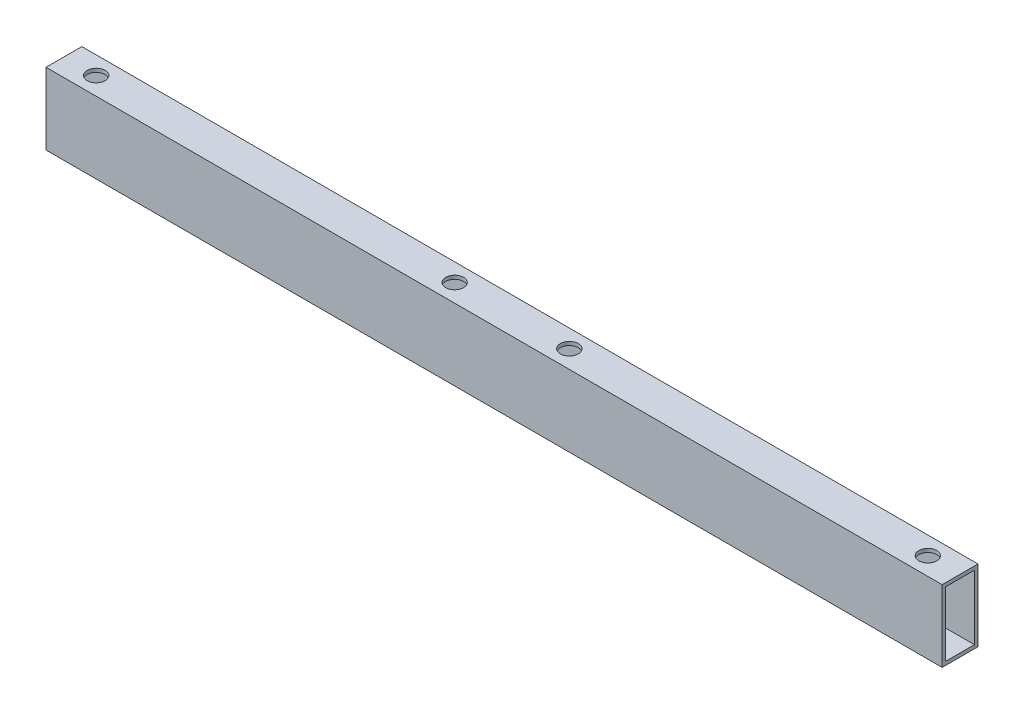
ISO-10303-21;
HEADER;
FILE_DESCRIPTION(('STEP AP214'),'2;1');
FILE_NAME('part.step','',(''),(''),'','','');
FILE_SCHEMA(('AUTOMOTIVE_DESIGN { 1 0 10303 214 1 1 1 1 }'));
ENDSEC;
DATA;
#1=APPLICATION_CONTEXT('core data for automotive mechanical design processes');
#2=APPLICATION_PROTOCOL_DEFINITION('international standard','automotive_design',2000,#1);
#3=PRODUCT_CONTEXT('',#1,'mechanical');
#4=PRODUCT('Part','Part','',(#3));
#5=PRODUCT_RELATED_PRODUCT_CATEGORY('part','',(#4));
#6=PRODUCT_DEFINITION_FORMATION('','',#4);
#7=PRODUCT_DEFINITION_CONTEXT('part definition',#1,'design');
#8=PRODUCT_DEFINITION('design','',#6,#7);
#9=PRODUCT_DEFINITION_SHAPE('','',#8);
#10=(LENGTH_UNIT() NAMED_UNIT(*) SI_UNIT(.MILLI.,.METRE.));
#11=(NAMED_UNIT(*) PLANE_ANGLE_UNIT() SI_UNIT($,.RADIAN.));
#12=(NAMED_UNIT(*) SI_UNIT($,.STERADIAN.) SOLID_ANGLE_UNIT());
#13=UNCERTAINTY_MEASURE_WITH_UNIT(LENGTH_MEASURE(1.E-05),#10,'distance_accuracy_value','');
#14=(GEOMETRIC_REPRESENTATION_CONTEXT(3) GLOBAL_UNCERTAINTY_ASSIGNED_CONTEXT((#13)) GLOBAL_UNIT_ASSIGNED_CONTEXT((#10,
#11,#12)) REPRESENTATION_CONTEXT('',''));
#15=CARTESIAN_POINT('',(0.,0.,0.));
#16=DIRECTION('',(0.,0.,1.));
#17=DIRECTION('',(1.,0.,0.));
#18=AXIS2_PLACEMENT_3D('',#15,#16,#17);
#19=CARTESIAN_POINT('',(250.,0.,0.));
#20=DIRECTION('',(-1.,0.,0.));
#21=DIRECTION('',(0.,0.,1.));
#22=AXIS2_PLACEMENT_3D('',#19,#20,#21);
#23=PLANE('',#22);
#24=DIRECTION('',(0.,1.,0.));
#25=VECTOR('',#24,1.);
#26=CARTESIAN_POINT('',(250.,-10.,-5.));
#27=LINE('',#26,#25);
#28=CARTESIAN_POINT('',(250.,-10.,-5.));
#29=VERTEX_POINT('',#28);
#30=CARTESIAN_POINT('',(250.,10.,-5.));
#31=VERTEX_POINT('',#30);
#32=EDGE_CURVE('E148',#29,#31,#27,.T.);
#33=ORIENTED_EDGE('',*,*,#32,.T.);
#34=DIRECTION('',(0.,0.,1.));
#35=VECTOR('',#34,1.);
#36=CARTESIAN_POINT('',(250.,10.,5.));
#37=LINE('',#36,#35);
#38=CARTESIAN_POINT('',(250.,10.,5.));
#39=VERTEX_POINT('',#38);
#40=EDGE_CURVE('E151',#31,#39,#37,.T.);
#41=ORIENTED_EDGE('',*,*,#40,.T.);
#42=DIRECTION('',(0.,-1.,0.));
#43=VECTOR('',#42,1.);
#44=CARTESIAN_POINT('',(250.,-10.,5.));
#45=LINE('',#44,#43);
#46=CARTESIAN_POINT('',(250.,-10.,5.));
#47=VERTEX_POINT('',#46);
#48=EDGE_CURVE('E154',#39,#47,#45,.T.);
#49=ORIENTED_EDGE('',*,*,#48,.T.);
#50=DIRECTION('',(0.,0.,-1.));
#51=VECTOR('',#50,1.);
#52=CARTESIAN_POINT('',(250.,-10.,5.));
#53=LINE('',#52,#51);
#54=EDGE_CURVE('E156',#47,#29,#53,.T.);
#55=ORIENTED_EDGE('',*,*,#54,.T.);
#56=EDGE_LOOP('',(#33,#41,#49,#55));
#57=FACE_BOUND('',#56,.T.);
#58=DIRECTION('',(0.,0.,-1.));
#59=VECTOR('',#58,1.);
#60=CARTESIAN_POINT('',(250.,-9.,4.));
#61=LINE('',#60,#59);
#62=CARTESIAN_POINT('',(250.,-9.,4.));
#63=VERTEX_POINT('',#62);
#64=CARTESIAN_POINT('',(250.,-9.,-4.));
#65=VERTEX_POINT('',#64);
#66=EDGE_CURVE('E110',#63,#65,#61,.T.);
#67=ORIENTED_EDGE('',*,*,#66,.F.);
#68=DIRECTION('',(0.,-1.,0.));
#69=VECTOR('',#68,1.);
#70=CARTESIAN_POINT('',(250.,-9.,4.));
#71=LINE('',#70,#69);
#72=CARTESIAN_POINT('',(250.,9.,4.));
#73=VERTEX_POINT('',#72);
#74=EDGE_CURVE('E132',#73,#63,#71,.T.);
#75=ORIENTED_EDGE('',*,*,#74,.F.);
#76=DIRECTION('',(0.,0.,1.));
#77=VECTOR('',#76,1.);
#78=CARTESIAN_POINT('',(250.,9.,4.));
#79=LINE('',#78,#77);
#80=CARTESIAN_POINT('',(250.,9.,-4.));
#81=VERTEX_POINT('',#80);
#82=EDGE_CURVE('E130',#81,#73,#79,.T.);
#83=ORIENTED_EDGE('',*,*,#82,.F.);
#84=DIRECTION('',(0.,1.,0.));
#85=VECTOR('',#84,1.);
#86=CARTESIAN_POINT('',(250.,-9.,-4.));
#87=LINE('',#86,#85);
#88=EDGE_CURVE('E118',#65,#81,#87,.T.);
#89=ORIENTED_EDGE('',*,*,#88,.F.);
#90=EDGE_LOOP('',(#67,#75,#83,#89));
#91=FACE_BOUND('',#90,.T.);
#92=ADVANCED_FACE('F43',(#57,#91),#23,.F.);
#93=CARTESIAN_POINT('',(0.,0.,0.));
#94=DIRECTION('',(-1.,0.,0.));
#95=DIRECTION('',(0.,0.,1.));
#96=AXIS2_PLACEMENT_3D('',#93,#94,#95);
#97=PLANE('',#96);
#98=DIRECTION('',(0.,1.,0.));
#99=VECTOR('',#98,1.);
#100=CARTESIAN_POINT('',(0.,-10.,-5.));
#101=LINE('',#100,#99);
#102=CARTESIAN_POINT('',(0.,-10.,-5.));
#103=VERTEX_POINT('',#102);
#104=CARTESIAN_POINT('',(0.,10.,-5.));
#105=VERTEX_POINT('',#104);
#106=EDGE_CURVE('E126',#103,#105,#101,.T.);
#107=ORIENTED_EDGE('',*,*,#106,.F.);
#108=DIRECTION('',(0.,0.,-1.));
#109=VECTOR('',#108,1.);
#110=CARTESIAN_POINT('',(0.,-10.,5.));
#111=LINE('',#110,#109);
#112=CARTESIAN_POINT('',(0.,-10.,5.));
#113=VERTEX_POINT('',#112);
#114=EDGE_CURVE('E152',#113,#103,#111,.T.);
#115=ORIENTED_EDGE('',*,*,#114,.F.);
#116=DIRECTION('',(0.,-1.,0.));
#117=VECTOR('',#116,1.);
#118=CARTESIAN_POINT('',(0.,-10.,5.));
#119=LINE('',#118,#117);
#120=CARTESIAN_POINT('',(0.,10.,5.));
#121=VERTEX_POINT('',#120);
#122=EDGE_CURVE('E163',#121,#113,#119,.T.);
#123=ORIENTED_EDGE('',*,*,#122,.F.);
#124=DIRECTION('',(0.,0.,1.));
#125=VECTOR('',#124,1.);
#126=CARTESIAN_POINT('',(0.,10.,5.));
#127=LINE('',#126,#125);
#128=EDGE_CURVE('E161',#105,#121,#127,.T.);
#129=ORIENTED_EDGE('',*,*,#128,.F.);
#130=EDGE_LOOP('',(#107,#115,#123,#129));
#131=FACE_BOUND('',#130,.T.);
#132=DIRECTION('',(0.,-1.,0.));
#133=VECTOR('',#132,1.);
#134=CARTESIAN_POINT('',(0.,-9.,4.));
#135=LINE('',#134,#133);
#136=CARTESIAN_POINT('',(0.,9.,4.));
#137=VERTEX_POINT('',#136);
#138=CARTESIAN_POINT('',(0.,-9.,4.));
#139=VERTEX_POINT('',#138);
#140=EDGE_CURVE('E119',#137,#139,#135,.T.);
#141=ORIENTED_EDGE('',*,*,#140,.T.);
#142=DIRECTION('',(0.,0.,-1.));
#143=VECTOR('',#142,1.);
#144=CARTESIAN_POINT('',(0.,-9.,4.));
#145=LINE('',#144,#143);
#146=CARTESIAN_POINT('',(0.,-9.,-4.));
#147=VERTEX_POINT('',#146);
#148=EDGE_CURVE('E68',#139,#147,#145,.T.);
#149=ORIENTED_EDGE('',*,*,#148,.T.);
#150=DIRECTION('',(0.,1.,0.));
#151=VECTOR('',#150,1.);
#152=CARTESIAN_POINT('',(0.,-9.,-4.));
#153=LINE('',#152,#151);
#154=CARTESIAN_POINT('',(0.,9.,-4.));
#155=VERTEX_POINT('',#154);
#156=EDGE_CURVE('E125',#147,#155,#153,.T.);
#157=ORIENTED_EDGE('',*,*,#156,.T.);
#158=DIRECTION('',(0.,0.,1.));
#159=VECTOR('',#158,1.);
#160=CARTESIAN_POINT('',(0.,9.,4.));
#161=LINE('',#160,#159);
#162=EDGE_CURVE('E140',#155,#137,#161,.T.);
#163=ORIENTED_EDGE('',*,*,#162,.T.);
#164=EDGE_LOOP('',(#141,#149,#157,#163));
#165=FACE_BOUND('',#164,.T.);
#166=ADVANCED_FACE('F252',(#131,#165),#97,.T.);
#167=CARTESIAN_POINT('',(250.,-10.,-5.));
#168=DIRECTION('',(0.,0.,1.));
#169=DIRECTION('',(1.,0.,0.));
#170=AXIS2_PLACEMENT_3D('',#167,#168,#169);
#171=PLANE('',#170);
#172=ORIENTED_EDGE('',*,*,#106,.T.);
#173=DIRECTION('',(-1.,0.,0.));
#174=VECTOR('',#173,1.);
#175=CARTESIAN_POINT('',(250.,10.,-5.));
#176=LINE('',#175,#174);
#177=EDGE_CURVE('E11',#31,#105,#176,.T.);
#178=ORIENTED_EDGE('',*,*,#177,.F.);
#179=ORIENTED_EDGE('',*,*,#32,.F.);
#180=DIRECTION('',(-1.,0.,0.));
#181=VECTOR('',#180,1.);
#182=CARTESIAN_POINT('',(250.,-10.,-5.));
#183=LINE('',#182,#181);
#184=EDGE_CURVE('E158',#29,#103,#183,.T.);
#185=ORIENTED_EDGE('',*,*,#184,.T.);
#186=EDGE_LOOP('',(#172,#178,#179,#185));
#187=FACE_BOUND('',#186,.T.);
#188=ADVANCED_FACE('F45',(#187),#171,.F.);
#189=CARTESIAN_POINT('',(250.,10.,5.));
#190=DIRECTION('',(0.,-1.,0.));
#191=DIRECTION('',(0.,0.,-1.));
#192=AXIS2_PLACEMENT_3D('',#189,#190,#191);
#193=PLANE('',#192);
#194=CARTESIAN_POINT('',(109.,10.,0.));
#195=DIRECTION('',(0.,1.,0.));
#196=DIRECTION('',(0.,0.,1.));
#197=AXIS2_PLACEMENT_3D('',#194,#195,#196);
#198=CIRCLE('',#197,2.5);
#199=CARTESIAN_POINT('',(109.,10.,2.49999999999998));
#200=VERTEX_POINT('',#199);
#201=EDGE_CURVE('E189',#200,#200,#198,.T.);
#202=ORIENTED_EDGE('',*,*,#201,.F.);
#203=EDGE_LOOP('',(#202));
#204=FACE_BOUND('',#203,.T.);
#205=CARTESIAN_POINT('',(141.,10.,0.));
#206=DIRECTION('',(0.,1.,0.));
#207=DIRECTION('',(0.,0.,1.));
#208=AXIS2_PLACEMENT_3D('',#205,#206,#207);
#209=CIRCLE('',#208,2.5);
#210=CARTESIAN_POINT('',(141.,10.,2.49999999999997));
#211=VERTEX_POINT('',#210);
#212=EDGE_CURVE('E194',#211,#211,#209,.T.);
#213=ORIENTED_EDGE('',*,*,#212,.F.);
#214=EDGE_LOOP('',(#213));
#215=FACE_BOUND('',#214,.T.);
#216=CARTESIAN_POINT('',(241.,10.,0.));
#217=DIRECTION('',(0.,1.,0.));
#218=DIRECTION('',(0.,0.,1.));
#219=AXIS2_PLACEMENT_3D('',#216,#217,#218);
#220=CIRCLE('',#219,2.5);
#221=CARTESIAN_POINT('',(241.,10.,2.5));
#222=VERTEX_POINT('',#221);
#223=EDGE_CURVE('E208',#222,#222,#220,.T.);
#224=ORIENTED_EDGE('',*,*,#223,.F.);
#225=EDGE_LOOP('',(#224));
#226=FACE_BOUND('',#225,.T.);
#227=CARTESIAN_POINT('',(9.,10.,0.));
#228=DIRECTION('',(0.,1.,0.));
#229=DIRECTION('',(0.,0.,1.));
#230=AXIS2_PLACEMENT_3D('',#227,#228,#229);
#231=CIRCLE('',#230,2.5);
#232=CARTESIAN_POINT('',(9.,10.,2.5));
#233=VERTEX_POINT('',#232);
#234=EDGE_CURVE('E211',#233,#233,#231,.T.);
#235=ORIENTED_EDGE('',*,*,#234,.F.);
#236=EDGE_LOOP('',(#235));
#237=FACE_BOUND('',#236,.T.);
#238=ORIENTED_EDGE('',*,*,#128,.T.);
#239=DIRECTION('',(-1.,0.,0.));
#240=VECTOR('',#239,1.);
#241=CARTESIAN_POINT('',(250.,10.,5.));
#242=LINE('',#241,#240);
#243=EDGE_CURVE('E52',#39,#121,#242,.T.);
#244=ORIENTED_EDGE('',*,*,#243,.F.);
#245=ORIENTED_EDGE('',*,*,#40,.F.);
#246=ORIENTED_EDGE('',*,*,#177,.T.);
#247=EDGE_LOOP('',(#238,#244,#245,#246));
#248=FACE_BOUND('',#247,.T.);
#249=ADVANCED_FACE('F256',(#204,#215,#226,#237,#248),#193,.F.);
#250=CARTESIAN_POINT('',(250.,-10.,5.));
#251=DIRECTION('',(0.,0.,-1.));
#252=DIRECTION('',(-1.,0.,0.));
#253=AXIS2_PLACEMENT_3D('',#250,#251,#252);
#254=PLANE('',#253);
#255=ORIENTED_EDGE('',*,*,#122,.T.);
#256=DIRECTION('',(-1.,0.,0.));
#257=VECTOR('',#256,1.);
#258=CARTESIAN_POINT('',(250.,-10.,5.));
#259=LINE('',#258,#257);
#260=EDGE_CURVE('E168',#47,#113,#259,.T.);
#261=ORIENTED_EDGE('',*,*,#260,.F.);
#262=ORIENTED_EDGE('',*,*,#48,.F.);
#263=ORIENTED_EDGE('',*,*,#243,.T.);
#264=EDGE_LOOP('',(#255,#261,#262,#263));
#265=FACE_BOUND('',#264,.T.);
#266=ADVANCED_FACE('F240',(#265),#254,.F.);
#267=CARTESIAN_POINT('',(250.,-10.,5.));
#268=DIRECTION('',(0.,1.,0.));
#269=DIRECTION('',(0.,0.,1.));
#270=AXIS2_PLACEMENT_3D('',#267,#268,#269);
#271=PLANE('',#270);
#272=CARTESIAN_POINT('',(109.,-10.,0.));
#273=DIRECTION('',(0.,1.,0.));
#274=DIRECTION('',(0.,0.,1.));
#275=AXIS2_PLACEMENT_3D('',#272,#273,#274);
#276=CIRCLE('',#275,2.5);
#277=CARTESIAN_POINT('',(109.,-10.,2.49999999999998));
#278=VERTEX_POINT('',#277);
#279=EDGE_CURVE('E183',#278,#278,#276,.T.);
#280=ORIENTED_EDGE('',*,*,#279,.T.);
#281=EDGE_LOOP('',(#280));
#282=FACE_BOUND('',#281,.T.);
#283=CARTESIAN_POINT('',(141.,-10.,0.));
#284=DIRECTION('',(0.,1.,0.));
#285=DIRECTION('',(0.,0.,1.));
#286=AXIS2_PLACEMENT_3D('',#283,#284,#285);
#287=CIRCLE('',#286,2.5);
#288=CARTESIAN_POINT('',(141.,-10.,2.49999999999997));
#289=VERTEX_POINT('',#288);
#290=EDGE_CURVE('E199',#289,#289,#287,.T.);
#291=ORIENTED_EDGE('',*,*,#290,.T.);
#292=EDGE_LOOP('',(#291));
#293=FACE_BOUND('',#292,.T.);
#294=CARTESIAN_POINT('',(241.,-10.,0.));
#295=DIRECTION('',(0.,1.,0.));
#296=DIRECTION('',(0.,0.,1.));
#297=AXIS2_PLACEMENT_3D('',#294,#295,#296);
#298=CIRCLE('',#297,2.5);
#299=CARTESIAN_POINT('',(241.,-10.,2.5));
#300=VERTEX_POINT('',#299);
#301=EDGE_CURVE('E177',#300,#300,#298,.T.);
#302=ORIENTED_EDGE('',*,*,#301,.T.);
#303=EDGE_LOOP('',(#302));
#304=FACE_BOUND('',#303,.T.);
#305=CARTESIAN_POINT('',(9.,-10.,0.));
#306=DIRECTION('',(0.,1.,0.));
#307=DIRECTION('',(0.,0.,1.));
#308=AXIS2_PLACEMENT_3D('',#305,#306,#307);
#309=CIRCLE('',#308,2.5);
#310=CARTESIAN_POINT('',(9.,-10.,2.5));
#311=VERTEX_POINT('',#310);
#312=EDGE_CURVE('E205',#311,#311,#309,.T.);
#313=ORIENTED_EDGE('',*,*,#312,.T.);
#314=EDGE_LOOP('',(#313));
#315=FACE_BOUND('',#314,.T.);
#316=ORIENTED_EDGE('',*,*,#114,.T.);
#317=ORIENTED_EDGE('',*,*,#184,.F.);
#318=ORIENTED_EDGE('',*,*,#54,.F.);
#319=ORIENTED_EDGE('',*,*,#260,.T.);
#320=EDGE_LOOP('',(#316,#317,#318,#319));
#321=FACE_BOUND('',#320,.T.);
#322=ADVANCED_FACE('F225',(#282,#293,#304,#315,#321),#271,.F.);
#323=CARTESIAN_POINT('',(250.,-9.,4.));
#324=DIRECTION('',(0.,1.,0.));
#325=DIRECTION('',(0.,0.,1.));
#326=AXIS2_PLACEMENT_3D('',#323,#324,#325);
#327=PLANE('',#326);
#328=CARTESIAN_POINT('',(109.,-9.,0.));
#329=DIRECTION('',(0.,1.,0.));
#330=DIRECTION('',(0.,0.,1.));
#331=AXIS2_PLACEMENT_3D('',#328,#329,#330);
#332=CIRCLE('',#331,2.5);
#333=CARTESIAN_POINT('',(109.,-9.,2.49999999999998));
#334=VERTEX_POINT('',#333);
#335=EDGE_CURVE('E202',#334,#334,#332,.T.);
#336=ORIENTED_EDGE('',*,*,#335,.F.);
#337=EDGE_LOOP('',(#336));
#338=FACE_BOUND('',#337,.T.);
#339=CARTESIAN_POINT('',(141.,-9.,0.));
#340=DIRECTION('',(0.,1.,0.));
#341=DIRECTION('',(0.,0.,1.));
#342=AXIS2_PLACEMENT_3D('',#339,#340,#341);
#343=CIRCLE('',#342,2.5);
#344=CARTESIAN_POINT('',(141.,-9.,2.49999999999997));
#345=VERTEX_POINT('',#344);
#346=EDGE_CURVE('E182',#345,#345,#343,.T.);
#347=ORIENTED_EDGE('',*,*,#346,.F.);
#348=EDGE_LOOP('',(#347));
#349=FACE_BOUND('',#348,.T.);
#350=CARTESIAN_POINT('',(241.,-9.,0.));
#351=DIRECTION('',(0.,1.,0.));
#352=DIRECTION('',(0.,0.,1.));
#353=AXIS2_PLACEMENT_3D('',#350,#351,#352);
#354=CIRCLE('',#353,2.5);
#355=CARTESIAN_POINT('',(241.,-9.,2.5));
#356=VERTEX_POINT('',#355);
#357=EDGE_CURVE('E138',#356,#356,#354,.T.);
#358=ORIENTED_EDGE('',*,*,#357,.F.);
#359=EDGE_LOOP('',(#358));
#360=FACE_BOUND('',#359,.T.);
#361=CARTESIAN_POINT('',(9.,-9.,0.));
#362=DIRECTION('',(0.,1.,0.));
#363=DIRECTION('',(0.,0.,1.));
#364=AXIS2_PLACEMENT_3D('',#361,#362,#363);
#365=CIRCLE('',#364,2.5);
#366=CARTESIAN_POINT('',(9.,-9.,2.5));
#367=VERTEX_POINT('',#366);
#368=EDGE_CURVE('E176',#367,#367,#365,.T.);
#369=ORIENTED_EDGE('',*,*,#368,.F.);
#370=EDGE_LOOP('',(#369));
#371=FACE_BOUND('',#370,.T.);
#372=ORIENTED_EDGE('',*,*,#148,.F.);
#373=DIRECTION('',(-1.,0.,0.));
#374=VECTOR('',#373,1.);
#375=CARTESIAN_POINT('',(250.,-9.,4.));
#376=LINE('',#375,#374);
#377=EDGE_CURVE('E114',#63,#139,#376,.T.);
#378=ORIENTED_EDGE('',*,*,#377,.F.);
#379=ORIENTED_EDGE('',*,*,#66,.T.);
#380=DIRECTION('',(-1.,0.,0.));
#381=VECTOR('',#380,1.);
#382=CARTESIAN_POINT('',(250.,-9.,-4.));
#383=LINE('',#382,#381);
#384=EDGE_CURVE('E113',#65,#147,#383,.T.);
#385=ORIENTED_EDGE('',*,*,#384,.T.);
#386=EDGE_LOOP('',(#372,#378,#379,#385));
#387=FACE_BOUND('',#386,.T.);
#388=ADVANCED_FACE('F112',(#338,#349,#360,#371,#387),#327,.T.);
#389=CARTESIAN_POINT('',(250.,-9.,-4.));
#390=DIRECTION('',(0.,0.,1.));
#391=DIRECTION('',(1.,0.,0.));
#392=AXIS2_PLACEMENT_3D('',#389,#390,#391);
#393=PLANE('',#392);
#394=ORIENTED_EDGE('',*,*,#156,.F.);
#395=ORIENTED_EDGE('',*,*,#384,.F.);
#396=ORIENTED_EDGE('',*,*,#88,.T.);
#397=DIRECTION('',(-1.,0.,0.));
#398=VECTOR('',#397,1.);
#399=CARTESIAN_POINT('',(250.,9.,-4.));
#400=LINE('',#399,#398);
#401=EDGE_CURVE('E127',#81,#155,#400,.T.);
#402=ORIENTED_EDGE('',*,*,#401,.T.);
#403=EDGE_LOOP('',(#394,#395,#396,#402));
#404=FACE_BOUND('',#403,.T.);
#405=ADVANCED_FACE('F122',(#404),#393,.T.);
#406=CARTESIAN_POINT('',(250.,9.,4.));
#407=DIRECTION('',(0.,-1.,0.));
#408=DIRECTION('',(0.,0.,-1.));
#409=AXIS2_PLACEMENT_3D('',#406,#407,#408);
#410=PLANE('',#409);
#411=CARTESIAN_POINT('',(109.,9.,0.));
#412=DIRECTION('',(0.,-1.,0.));
#413=DIRECTION('',(0.,0.,-1.));
#414=AXIS2_PLACEMENT_3D('',#411,#412,#413);
#415=CIRCLE('',#414,2.5);
#416=CARTESIAN_POINT('',(109.,9.,-2.50000000000001));
#417=VERTEX_POINT('',#416);
#418=EDGE_CURVE('E47',#417,#417,#415,.T.);
#419=ORIENTED_EDGE('',*,*,#418,.F.);
#420=EDGE_LOOP('',(#419));
#421=FACE_BOUND('',#420,.T.);
#422=CARTESIAN_POINT('',(141.,9.,0.));
#423=DIRECTION('',(0.,-1.,0.));
#424=DIRECTION('',(0.,0.,-1.));
#425=AXIS2_PLACEMENT_3D('',#422,#423,#424);
#426=CIRCLE('',#425,2.5);
#427=CARTESIAN_POINT('',(141.,9.,-2.50000000000002));
#428=VERTEX_POINT('',#427);
#429=EDGE_CURVE('E180',#428,#428,#426,.T.);
#430=ORIENTED_EDGE('',*,*,#429,.F.);
#431=EDGE_LOOP('',(#430));
#432=FACE_BOUND('',#431,.T.);
#433=CARTESIAN_POINT('',(241.,9.,0.));
#434=DIRECTION('',(0.,-1.,0.));
#435=DIRECTION('',(0.,0.,-1.));
#436=AXIS2_PLACEMENT_3D('',#433,#434,#435);
#437=CIRCLE('',#436,2.5);
#438=CARTESIAN_POINT('',(241.,9.,-2.49999999999999));
#439=VERTEX_POINT('',#438);
#440=EDGE_CURVE('E178',#439,#439,#437,.T.);
#441=ORIENTED_EDGE('',*,*,#440,.F.);
#442=EDGE_LOOP('',(#441));
#443=FACE_BOUND('',#442,.T.);
#444=CARTESIAN_POINT('',(9.,9.,0.));
#445=DIRECTION('',(0.,-1.,0.));
#446=DIRECTION('',(0.,0.,-1.));
#447=AXIS2_PLACEMENT_3D('',#444,#445,#446);
#448=CIRCLE('',#447,2.5);
#449=CARTESIAN_POINT('',(9.,9.,-2.5));
#450=VERTEX_POINT('',#449);
#451=EDGE_CURVE('E173',#450,#450,#448,.T.);
#452=ORIENTED_EDGE('',*,*,#451,.F.);
#453=EDGE_LOOP('',(#452));
#454=FACE_BOUND('',#453,.T.);
#455=ORIENTED_EDGE('',*,*,#162,.F.);
#456=ORIENTED_EDGE('',*,*,#401,.F.);
#457=ORIENTED_EDGE('',*,*,#82,.T.);
#458=DIRECTION('',(-1.,0.,0.));
#459=VECTOR('',#458,1.);
#460=CARTESIAN_POINT('',(250.,9.,4.));
#461=LINE('',#460,#459);
#462=EDGE_CURVE('E60',#73,#137,#461,.T.);
#463=ORIENTED_EDGE('',*,*,#462,.T.);
#464=EDGE_LOOP('',(#455,#456,#457,#463));
#465=FACE_BOUND('',#464,.T.);
#466=ADVANCED_FACE('F276',(#421,#432,#443,#454,#465),#410,.T.);
#467=CARTESIAN_POINT('',(250.,-9.,4.));
#468=DIRECTION('',(0.,0.,-1.));
#469=DIRECTION('',(-1.,0.,0.));
#470=AXIS2_PLACEMENT_3D('',#467,#468,#469);
#471=PLANE('',#470);
#472=ORIENTED_EDGE('',*,*,#140,.F.);
#473=ORIENTED_EDGE('',*,*,#462,.F.);
#474=ORIENTED_EDGE('',*,*,#74,.T.);
#475=ORIENTED_EDGE('',*,*,#377,.T.);
#476=EDGE_LOOP('',(#472,#473,#474,#475));
#477=FACE_BOUND('',#476,.T.);
#478=ADVANCED_FACE('F279',(#477),#471,.T.);
#479=CARTESIAN_POINT('',(9.,-10.,0.));
#480=DIRECTION('',(0.,1.,0.));
#481=DIRECTION('',(0.,0.,1.));
#482=AXIS2_PLACEMENT_3D('',#479,#480,#481);
#483=CYLINDRICAL_SURFACE('',#482,2.5);
#484=ORIENTED_EDGE('',*,*,#451,.T.);
#485=EDGE_LOOP('',(#484));
#486=FACE_BOUND('',#485,.T.);
#487=ORIENTED_EDGE('',*,*,#234,.T.);
#488=EDGE_LOOP('',(#487));
#489=FACE_BOUND('',#488,.T.);
#490=ADVANCED_FACE('F235',(#486,#489),#483,.F.);
#491=CARTESIAN_POINT('',(241.,-10.,0.));
#492=DIRECTION('',(0.,1.,0.));
#493=DIRECTION('',(0.,0.,1.));
#494=AXIS2_PLACEMENT_3D('',#491,#492,#493);
#495=CYLINDRICAL_SURFACE('',#494,2.5);
#496=ORIENTED_EDGE('',*,*,#440,.T.);
#497=EDGE_LOOP('',(#496));
#498=FACE_BOUND('',#497,.T.);
#499=ORIENTED_EDGE('',*,*,#223,.T.);
#500=EDGE_LOOP('',(#499));
#501=FACE_BOUND('',#500,.T.);
#502=ADVANCED_FACE('F233',(#498,#501),#495,.F.);
#503=ORIENTED_EDGE('',*,*,#368,.T.);
#504=EDGE_LOOP('',(#503));
#505=FACE_BOUND('',#504,.T.);
#506=ORIENTED_EDGE('',*,*,#312,.F.);
#507=EDGE_LOOP('',(#506));
#508=FACE_BOUND('',#507,.T.);
#509=ADVANCED_FACE('F230',(#505,#508),#483,.F.);
#510=ORIENTED_EDGE('',*,*,#357,.T.);
#511=EDGE_LOOP('',(#510));
#512=FACE_BOUND('',#511,.T.);
#513=ORIENTED_EDGE('',*,*,#301,.F.);
#514=EDGE_LOOP('',(#513));
#515=FACE_BOUND('',#514,.T.);
#516=ADVANCED_FACE('F220',(#512,#515),#495,.F.);
#517=CARTESIAN_POINT('',(141.,-10.,0.));
#518=DIRECTION('',(0.,1.,0.));
#519=DIRECTION('',(0.,0.,1.));
#520=AXIS2_PLACEMENT_3D('',#517,#518,#519);
#521=CYLINDRICAL_SURFACE('',#520,2.5);
#522=ORIENTED_EDGE('',*,*,#429,.T.);
#523=EDGE_LOOP('',(#522));
#524=FACE_BOUND('',#523,.T.);
#525=ORIENTED_EDGE('',*,*,#212,.T.);
#526=EDGE_LOOP('',(#525));
#527=FACE_BOUND('',#526,.T.);
#528=ADVANCED_FACE('F288',(#524,#527),#521,.F.);
#529=CARTESIAN_POINT('',(109.,-10.,0.));
#530=DIRECTION('',(0.,1.,0.));
#531=DIRECTION('',(0.,0.,1.));
#532=AXIS2_PLACEMENT_3D('',#529,#530,#531);
#533=CYLINDRICAL_SURFACE('',#532,2.5);
#534=ORIENTED_EDGE('',*,*,#418,.T.);
#535=EDGE_LOOP('',(#534));
#536=FACE_BOUND('',#535,.T.);
#537=ORIENTED_EDGE('',*,*,#201,.T.);
#538=EDGE_LOOP('',(#537));
#539=FACE_BOUND('',#538,.T.);
#540=ADVANCED_FACE('F291',(#536,#539),#533,.F.);
#541=ORIENTED_EDGE('',*,*,#346,.T.);
#542=EDGE_LOOP('',(#541));
#543=FACE_BOUND('',#542,.T.);
#544=ORIENTED_EDGE('',*,*,#290,.F.);
#545=EDGE_LOOP('',(#544));
#546=FACE_BOUND('',#545,.T.);
#547=ADVANCED_FACE('F292',(#543,#546),#521,.F.);
#548=ORIENTED_EDGE('',*,*,#335,.T.);
#549=EDGE_LOOP('',(#548));
#550=FACE_BOUND('',#549,.T.);
#551=ORIENTED_EDGE('',*,*,#279,.F.);
#552=EDGE_LOOP('',(#551));
#553=FACE_BOUND('',#552,.T.);
#554=ADVANCED_FACE('F295',(#550,#553),#533,.F.);
#555=CLOSED_SHELL('',(#92,#166,#188,#249,#266,#322,#388,#405,#466,#478,#490,#502,#509,#516,#528,
#540,#547,#554));
#556=MANIFOLD_SOLID_BREP('B2',#555);
#557=ADVANCED_BREP_SHAPE_REPRESENTATION('',(#18,#556),#14);
#558=SHAPE_DEFINITION_REPRESENTATION(#9,#557);
ENDSEC;
END-ISO-10303-21;
